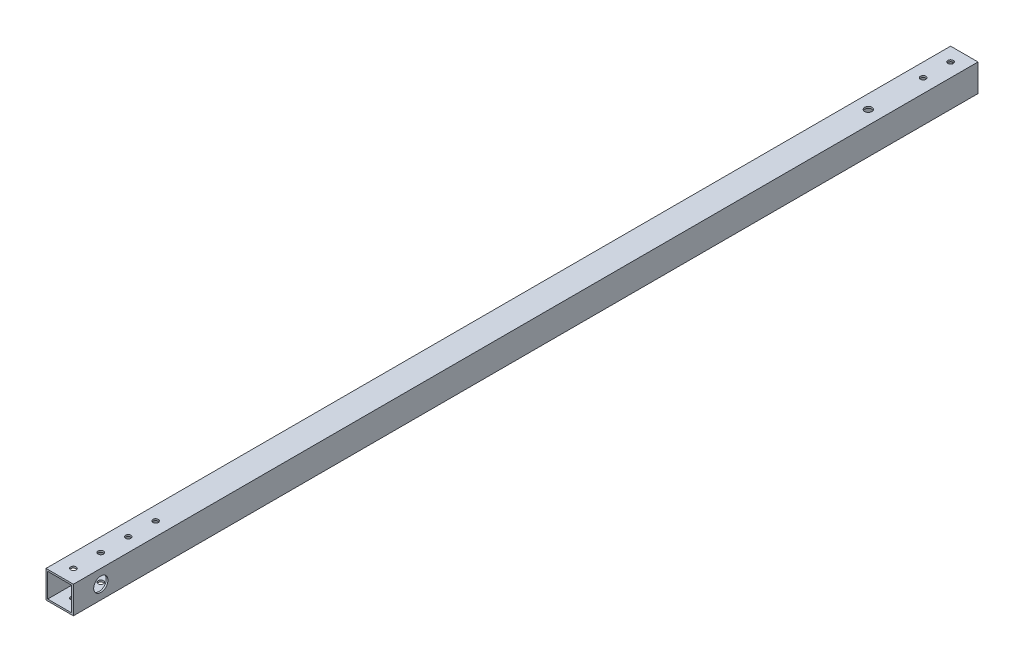
ISO-10303-21;
HEADER;
FILE_DESCRIPTION(('STEP AP214'),'2;1');
FILE_NAME('part.step','',(''),(''),'','','');
FILE_SCHEMA(('AUTOMOTIVE_DESIGN { 1 0 10303 214 1 1 1 1 }'));
ENDSEC;
DATA;
#1=APPLICATION_CONTEXT('core data for automotive mechanical design processes');
#2=APPLICATION_PROTOCOL_DEFINITION('international standard','automotive_design',2000,#1);
#3=PRODUCT_CONTEXT('',#1,'mechanical');
#4=PRODUCT('Part','Part','',(#3));
#5=PRODUCT_RELATED_PRODUCT_CATEGORY('part','',(#4));
#6=PRODUCT_DEFINITION_FORMATION('','',#4);
#7=PRODUCT_DEFINITION_CONTEXT('part definition',#1,'design');
#8=PRODUCT_DEFINITION('design','',#6,#7);
#9=PRODUCT_DEFINITION_SHAPE('','',#8);
#10=(LENGTH_UNIT() NAMED_UNIT(*) SI_UNIT(.MILLI.,.METRE.));
#11=(NAMED_UNIT(*) PLANE_ANGLE_UNIT() SI_UNIT($,.RADIAN.));
#12=(NAMED_UNIT(*) SI_UNIT($,.STERADIAN.) SOLID_ANGLE_UNIT());
#13=UNCERTAINTY_MEASURE_WITH_UNIT(LENGTH_MEASURE(1.E-05),#10,'distance_accuracy_value','');
#14=(GEOMETRIC_REPRESENTATION_CONTEXT(3) GLOBAL_UNCERTAINTY_ASSIGNED_CONTEXT((#13)) GLOBAL_UNIT_ASSIGNED_CONTEXT((#10,
#11,#12)) REPRESENTATION_CONTEXT('',''));
#15=CARTESIAN_POINT('',(0.,0.,0.));
#16=DIRECTION('',(0.,0.,1.));
#17=DIRECTION('',(1.,0.,0.));
#18=AXIS2_PLACEMENT_3D('',#15,#16,#17);
#19=CARTESIAN_POINT('',(0.,0.,838.2));
#20=DIRECTION('',(0.,0.,-1.));
#21=DIRECTION('',(-1.,0.,0.));
#22=AXIS2_PLACEMENT_3D('',#19,#20,#21);
#23=PLANE('',#22);
#24=DIRECTION('',(0.,-1.,0.));
#25=VECTOR('',#24,1.);
#26=CARTESIAN_POINT('',(0.,0.,838.2));
#27=LINE('',#26,#25);
#28=CARTESIAN_POINT('',(0.,25.4,838.2));
#29=VERTEX_POINT('',#28);
#30=CARTESIAN_POINT('',(0.,0.,838.2));
#31=VERTEX_POINT('',#30);
#32=EDGE_CURVE('E156',#29,#31,#27,.T.);
#33=ORIENTED_EDGE('',*,*,#32,.T.);
#34=DIRECTION('',(1.,0.,0.));
#35=VECTOR('',#34,1.);
#36=CARTESIAN_POINT('',(0.,0.,838.2));
#37=LINE('',#36,#35);
#38=CARTESIAN_POINT('',(25.4,0.,838.2));
#39=VERTEX_POINT('',#38);
#40=EDGE_CURVE('E160',#31,#39,#37,.T.);
#41=ORIENTED_EDGE('',*,*,#40,.T.);
#42=DIRECTION('',(0.,1.,0.));
#43=VECTOR('',#42,1.);
#44=CARTESIAN_POINT('',(25.4,0.,838.2));
#45=LINE('',#44,#43);
#46=CARTESIAN_POINT('',(25.4,25.4,838.2));
#47=VERTEX_POINT('',#46);
#48=EDGE_CURVE('E164',#39,#47,#45,.T.);
#49=ORIENTED_EDGE('',*,*,#48,.T.);
#50=DIRECTION('',(-1.,0.,0.));
#51=VECTOR('',#50,1.);
#52=CARTESIAN_POINT('',(0.,25.4,838.2));
#53=LINE('',#52,#51);
#54=EDGE_CURVE('E167',#47,#29,#53,.T.);
#55=ORIENTED_EDGE('',*,*,#54,.T.);
#56=EDGE_LOOP('',(#33,#41,#49,#55));
#57=FACE_BOUND('',#56,.T.);
#58=DIRECTION('',(0.,-1.,0.));
#59=VECTOR('',#58,1.);
#60=CARTESIAN_POINT('',(1.5875,1.5875,838.2));
#61=LINE('',#60,#59);
#62=CARTESIAN_POINT('',(1.5875,23.8125,838.2));
#63=VERTEX_POINT('',#62);
#64=CARTESIAN_POINT('',(1.5875,1.5875,838.2));
#65=VERTEX_POINT('',#64);
#66=EDGE_CURVE('E106',#63,#65,#61,.T.);
#67=ORIENTED_EDGE('',*,*,#66,.F.);
#68=DIRECTION('',(-1.,0.,0.));
#69=VECTOR('',#68,1.);
#70=CARTESIAN_POINT('',(1.5875,23.8125,838.2));
#71=LINE('',#70,#69);
#72=CARTESIAN_POINT('',(23.8125,23.8125,838.2));
#73=VERTEX_POINT('',#72);
#74=EDGE_CURVE('E132',#73,#63,#71,.T.);
#75=ORIENTED_EDGE('',*,*,#74,.F.);
#76=DIRECTION('',(0.,1.,0.));
#77=VECTOR('',#76,1.);
#78=CARTESIAN_POINT('',(23.8125,1.5875,838.2));
#79=LINE('',#78,#77);
#80=CARTESIAN_POINT('',(23.8125,1.5875,838.2));
#81=VERTEX_POINT('',#80);
#82=EDGE_CURVE('E128',#81,#73,#79,.T.);
#83=ORIENTED_EDGE('',*,*,#82,.F.);
#84=DIRECTION('',(1.,0.,0.));
#85=VECTOR('',#84,1.);
#86=CARTESIAN_POINT('',(1.5875,1.5875,838.2));
#87=LINE('',#86,#85);
#88=EDGE_CURVE('E115',#65,#81,#87,.T.);
#89=ORIENTED_EDGE('',*,*,#88,.F.);
#90=EDGE_LOOP('',(#67,#75,#83,#89));
#91=FACE_BOUND('',#90,.T.);
#92=ADVANCED_FACE('F38',(#57,#91),#23,.F.);
#93=CARTESIAN_POINT('',(0.,0.,0.));
#94=DIRECTION('',(0.,0.,-1.));
#95=DIRECTION('',(-1.,0.,0.));
#96=AXIS2_PLACEMENT_3D('',#93,#94,#95);
#97=PLANE('',#96);
#98=DIRECTION('',(0.,-1.,0.));
#99=VECTOR('',#98,1.);
#100=CARTESIAN_POINT('',(0.,0.,0.));
#101=LINE('',#100,#99);
#102=CARTESIAN_POINT('',(0.,25.4,0.));
#103=VERTEX_POINT('',#102);
#104=CARTESIAN_POINT('',(0.,0.,0.));
#105=VERTEX_POINT('',#104);
#106=EDGE_CURVE('E124',#103,#105,#101,.T.);
#107=ORIENTED_EDGE('',*,*,#106,.F.);
#108=DIRECTION('',(-1.,0.,0.));
#109=VECTOR('',#108,1.);
#110=CARTESIAN_POINT('',(0.,25.4,0.));
#111=LINE('',#110,#109);
#112=CARTESIAN_POINT('',(25.4,25.4,0.));
#113=VERTEX_POINT('',#112);
#114=EDGE_CURVE('E161',#113,#103,#111,.T.);
#115=ORIENTED_EDGE('',*,*,#114,.F.);
#116=DIRECTION('',(0.,1.,0.));
#117=VECTOR('',#116,1.);
#118=CARTESIAN_POINT('',(25.4,0.,0.));
#119=LINE('',#118,#117);
#120=CARTESIAN_POINT('',(25.4,0.,0.));
#121=VERTEX_POINT('',#120);
#122=EDGE_CURVE('E177',#121,#113,#119,.T.);
#123=ORIENTED_EDGE('',*,*,#122,.F.);
#124=DIRECTION('',(1.,0.,0.));
#125=VECTOR('',#124,1.);
#126=CARTESIAN_POINT('',(0.,0.,0.));
#127=LINE('',#126,#125);
#128=EDGE_CURVE('E174',#105,#121,#127,.T.);
#129=ORIENTED_EDGE('',*,*,#128,.F.);
#130=EDGE_LOOP('',(#107,#115,#123,#129));
#131=FACE_BOUND('',#130,.T.);
#132=DIRECTION('',(-1.,0.,0.));
#133=VECTOR('',#132,1.);
#134=CARTESIAN_POINT('',(1.5875,23.8125,0.));
#135=LINE('',#134,#133);
#136=CARTESIAN_POINT('',(23.8125,23.8125,0.));
#137=VERTEX_POINT('',#136);
#138=CARTESIAN_POINT('',(1.5875,23.8125,0.));
#139=VERTEX_POINT('',#138);
#140=EDGE_CURVE('E116',#137,#139,#135,.T.);
#141=ORIENTED_EDGE('',*,*,#140,.T.);
#142=DIRECTION('',(0.,-1.,0.));
#143=VECTOR('',#142,1.);
#144=CARTESIAN_POINT('',(1.5875,1.5875,0.));
#145=LINE('',#144,#143);
#146=CARTESIAN_POINT('',(1.5875,1.5875,0.));
#147=VERTEX_POINT('',#146);
#148=EDGE_CURVE('E64',#139,#147,#145,.T.);
#149=ORIENTED_EDGE('',*,*,#148,.T.);
#150=DIRECTION('',(1.,0.,0.));
#151=VECTOR('',#150,1.);
#152=CARTESIAN_POINT('',(1.5875,1.5875,0.));
#153=LINE('',#152,#151);
#154=CARTESIAN_POINT('',(23.8125,1.5875,0.));
#155=VERTEX_POINT('',#154);
#156=EDGE_CURVE('E122',#147,#155,#153,.T.);
#157=ORIENTED_EDGE('',*,*,#156,.T.);
#158=DIRECTION('',(0.,1.,0.));
#159=VECTOR('',#158,1.);
#160=CARTESIAN_POINT('',(23.8125,1.5875,0.));
#161=LINE('',#160,#159);
#162=EDGE_CURVE('E143',#155,#137,#161,.T.);
#163=ORIENTED_EDGE('',*,*,#162,.T.);
#164=EDGE_LOOP('',(#141,#149,#157,#163));
#165=FACE_BOUND('',#164,.T.);
#166=ADVANCED_FACE('F332',(#131,#165),#97,.T.);
#167=CARTESIAN_POINT('',(0.,0.,838.2));
#168=DIRECTION('',(1.,0.,0.));
#169=DIRECTION('',(0.,0.,-1.));
#170=AXIS2_PLACEMENT_3D('',#167,#168,#169);
#171=PLANE('',#170);
#172=CARTESIAN_POINT('',(0.,12.7,812.8));
#173=DIRECTION('',(1.,0.,0.));
#174=DIRECTION('',(0.,0.,-1.));
#175=AXIS2_PLACEMENT_3D('',#172,#173,#174);
#176=CIRCLE('',#175,6.60400000000008);
#177=CARTESIAN_POINT('',(0.,12.7,806.196));
#178=VERTEX_POINT('',#177);
#179=EDGE_CURVE('E313',#178,#178,#176,.T.);
#180=ORIENTED_EDGE('',*,*,#179,.T.);
#181=EDGE_LOOP('',(#180));
#182=FACE_BOUND('',#181,.T.);
#183=ORIENTED_EDGE('',*,*,#106,.T.);
#184=DIRECTION('',(0.,0.,-1.));
#185=VECTOR('',#184,1.);
#186=CARTESIAN_POINT('',(0.,0.,838.2));
#187=LINE('',#186,#185);
#188=EDGE_CURVE('E11',#31,#105,#187,.T.);
#189=ORIENTED_EDGE('',*,*,#188,.F.);
#190=ORIENTED_EDGE('',*,*,#32,.F.);
#191=DIRECTION('',(0.,0.,-1.));
#192=VECTOR('',#191,1.);
#193=CARTESIAN_POINT('',(0.,25.4,838.2));
#194=LINE('',#193,#192);
#195=EDGE_CURVE('E170',#29,#103,#194,.T.);
#196=ORIENTED_EDGE('',*,*,#195,.T.);
#197=EDGE_LOOP('',(#183,#189,#190,#196));
#198=FACE_BOUND('',#197,.T.);
#199=ADVANCED_FACE('F40',(#182,#198),#171,.F.);
#200=CARTESIAN_POINT('',(0.,0.,838.2));
#201=DIRECTION('',(0.,1.,0.));
#202=DIRECTION('',(0.,0.,1.));
#203=AXIS2_PLACEMENT_3D('',#200,#201,#202);
#204=PLANE('',#203);
#205=CARTESIAN_POINT('',(12.7,0.,12.7));
#206=DIRECTION('',(0.,1.,0.));
#207=DIRECTION('',(0.,0.,1.));
#208=AXIS2_PLACEMENT_3D('',#205,#206,#207);
#209=CIRCLE('',#208,2.54);
#210=CARTESIAN_POINT('',(12.7,0.,15.24));
#211=VERTEX_POINT('',#210);
#212=EDGE_CURVE('E197',#211,#211,#209,.T.);
#213=ORIENTED_EDGE('',*,*,#212,.T.);
#214=EDGE_LOOP('',(#213));
#215=FACE_BOUND('',#214,.T.);
#216=CARTESIAN_POINT('',(12.7,0.,749.3));
#217=DIRECTION('',(0.,1.,0.));
#218=DIRECTION('',(0.,0.,1.));
#219=AXIS2_PLACEMENT_3D('',#216,#217,#218);
#220=CIRCLE('',#219,2.53999999999992);
#221=CARTESIAN_POINT('',(12.7,0.,751.84));
#222=VERTEX_POINT('',#221);
#223=EDGE_CURVE('E288',#222,#222,#220,.T.);
#224=ORIENTED_EDGE('',*,*,#223,.T.);
#225=EDGE_LOOP('',(#224));
#226=FACE_BOUND('',#225,.T.);
#227=CARTESIAN_POINT('',(12.7,0.,774.7));
#228=DIRECTION('',(0.,1.,0.));
#229=DIRECTION('',(0.,0.,1.));
#230=AXIS2_PLACEMENT_3D('',#227,#228,#229);
#231=CIRCLE('',#230,2.53999999999992);
#232=CARTESIAN_POINT('',(12.7,0.,777.24));
#233=VERTEX_POINT('',#232);
#234=EDGE_CURVE('E273',#233,#233,#231,.T.);
#235=ORIENTED_EDGE('',*,*,#234,.T.);
#236=EDGE_LOOP('',(#235));
#237=FACE_BOUND('',#236,.T.);
#238=CARTESIAN_POINT('',(12.7,0.,88.9));
#239=DIRECTION('',(0.,1.,0.));
#240=DIRECTION('',(0.,0.,1.));
#241=AXIS2_PLACEMENT_3D('',#238,#239,#240);
#242=CIRCLE('',#241,3.42900000000001);
#243=CARTESIAN_POINT('',(12.7,0.,92.329));
#244=VERTEX_POINT('',#243);
#245=EDGE_CURVE('E263',#244,#244,#242,.T.);
#246=ORIENTED_EDGE('',*,*,#245,.T.);
#247=EDGE_LOOP('',(#246));
#248=FACE_BOUND('',#247,.T.);
#249=CARTESIAN_POINT('',(12.7,0.,825.5));
#250=DIRECTION('',(0.,1.,0.));
#251=DIRECTION('',(0.,0.,1.));
#252=AXIS2_PLACEMENT_3D('',#249,#250,#251);
#253=CIRCLE('',#252,2.53999999999992);
#254=CARTESIAN_POINT('',(12.7,0.,828.04));
#255=VERTEX_POINT('',#254);
#256=EDGE_CURVE('E254',#255,#255,#253,.T.);
#257=ORIENTED_EDGE('',*,*,#256,.T.);
#258=EDGE_LOOP('',(#257));
#259=FACE_BOUND('',#258,.T.);
#260=CARTESIAN_POINT('',(12.7,0.,38.1));
#261=DIRECTION('',(0.,1.,0.));
#262=DIRECTION('',(0.,0.,1.));
#263=AXIS2_PLACEMENT_3D('',#260,#261,#262);
#264=CIRCLE('',#263,2.54);
#265=CARTESIAN_POINT('',(12.7,0.,40.64));
#266=VERTEX_POINT('',#265);
#267=EDGE_CURVE('E255',#266,#266,#264,.T.);
#268=ORIENTED_EDGE('',*,*,#267,.T.);
#269=EDGE_LOOP('',(#268));
#270=FACE_BOUND('',#269,.T.);
#271=CARTESIAN_POINT('',(12.7,0.,800.1));
#272=DIRECTION('',(0.,1.,0.));
#273=DIRECTION('',(0.,0.,1.));
#274=AXIS2_PLACEMENT_3D('',#271,#272,#273);
#275=CIRCLE('',#274,2.53999999999992);
#276=CARTESIAN_POINT('',(12.7,0.,802.64));
#277=VERTEX_POINT('',#276);
#278=EDGE_CURVE('E272',#277,#277,#275,.T.);
#279=ORIENTED_EDGE('',*,*,#278,.T.);
#280=EDGE_LOOP('',(#279));
#281=FACE_BOUND('',#280,.T.);
#282=ORIENTED_EDGE('',*,*,#128,.T.);
#283=DIRECTION('',(0.,0.,-1.));
#284=VECTOR('',#283,1.);
#285=CARTESIAN_POINT('',(25.4,0.,838.2));
#286=LINE('',#285,#284);
#287=EDGE_CURVE('E48',#39,#121,#286,.T.);
#288=ORIENTED_EDGE('',*,*,#287,.F.);
#289=ORIENTED_EDGE('',*,*,#40,.F.);
#290=ORIENTED_EDGE('',*,*,#188,.T.);
#291=EDGE_LOOP('',(#282,#288,#289,#290));
#292=FACE_BOUND('',#291,.T.);
#293=ADVANCED_FACE('F364',(#215,#226,#237,#248,#259,#270,#281,#292),#204,.F.);
#294=CARTESIAN_POINT('',(25.4,0.,838.2));
#295=DIRECTION('',(-1.,0.,0.));
#296=DIRECTION('',(0.,0.,1.));
#297=AXIS2_PLACEMENT_3D('',#294,#295,#296);
#298=PLANE('',#297);
#299=CARTESIAN_POINT('',(25.4,12.7,812.8));
#300=DIRECTION('',(-1.,0.,0.));
#301=DIRECTION('',(0.,0.,1.));
#302=AXIS2_PLACEMENT_3D('',#299,#300,#301);
#303=CIRCLE('',#302,6.60400000000008);
#304=CARTESIAN_POINT('',(25.4,12.7,819.404));
#305=VERTEX_POINT('',#304);
#306=EDGE_CURVE('E289',#305,#305,#303,.T.);
#307=ORIENTED_EDGE('',*,*,#306,.T.);
#308=EDGE_LOOP('',(#307));
#309=FACE_BOUND('',#308,.T.);
#310=ORIENTED_EDGE('',*,*,#122,.T.);
#311=DIRECTION('',(0.,0.,-1.));
#312=VECTOR('',#311,1.);
#313=CARTESIAN_POINT('',(25.4,25.4,838.2));
#314=LINE('',#313,#312);
#315=EDGE_CURVE('E185',#47,#113,#314,.T.);
#316=ORIENTED_EDGE('',*,*,#315,.F.);
#317=ORIENTED_EDGE('',*,*,#48,.F.);
#318=ORIENTED_EDGE('',*,*,#287,.T.);
#319=EDGE_LOOP('',(#310,#316,#317,#318));
#320=FACE_BOUND('',#319,.T.);
#321=ADVANCED_FACE('F361',(#309,#320),#298,.F.);
#322=CARTESIAN_POINT('',(0.,25.4,838.2));
#323=DIRECTION('',(0.,-1.,0.));
#324=DIRECTION('',(0.,0.,-1.));
#325=AXIS2_PLACEMENT_3D('',#322,#323,#324);
#326=PLANE('',#325);
#327=CARTESIAN_POINT('',(12.7,25.4,12.7));
#328=DIRECTION('',(0.,1.,0.));
#329=DIRECTION('',(0.,0.,1.));
#330=AXIS2_PLACEMENT_3D('',#327,#328,#329);
#331=CIRCLE('',#330,2.54);
#332=CARTESIAN_POINT('',(12.7,25.4,15.24));
#333=VERTEX_POINT('',#332);
#334=EDGE_CURVE('E267',#333,#333,#331,.T.);
#335=ORIENTED_EDGE('',*,*,#334,.F.);
#336=EDGE_LOOP('',(#335));
#337=FACE_BOUND('',#336,.T.);
#338=CARTESIAN_POINT('',(12.7,25.4,749.3));
#339=DIRECTION('',(0.,1.,0.));
#340=DIRECTION('',(0.,0.,1.));
#341=AXIS2_PLACEMENT_3D('',#338,#339,#340);
#342=CIRCLE('',#341,2.53999999999992);
#343=CARTESIAN_POINT('',(12.7,25.4,751.84));
#344=VERTEX_POINT('',#343);
#345=EDGE_CURVE('E284',#344,#344,#342,.T.);
#346=ORIENTED_EDGE('',*,*,#345,.F.);
#347=EDGE_LOOP('',(#346));
#348=FACE_BOUND('',#347,.T.);
#349=CARTESIAN_POINT('',(12.7,25.4,774.7));
#350=DIRECTION('',(0.,1.,0.));
#351=DIRECTION('',(0.,0.,1.));
#352=AXIS2_PLACEMENT_3D('',#349,#350,#351);
#353=CIRCLE('',#352,2.53999999999992);
#354=CARTESIAN_POINT('',(12.7,25.4,777.24));
#355=VERTEX_POINT('',#354);
#356=EDGE_CURVE('E293',#355,#355,#353,.T.);
#357=ORIENTED_EDGE('',*,*,#356,.F.);
#358=EDGE_LOOP('',(#357));
#359=FACE_BOUND('',#358,.T.);
#360=CARTESIAN_POINT('',(12.7,25.4,88.9));
#361=DIRECTION('',(0.,1.,0.));
#362=DIRECTION('',(0.,0.,1.));
#363=AXIS2_PLACEMENT_3D('',#360,#361,#362);
#364=CIRCLE('',#363,3.42900000000001);
#365=CARTESIAN_POINT('',(12.7,25.4,92.329));
#366=VERTEX_POINT('',#365);
#367=EDGE_CURVE('E259',#366,#366,#364,.T.);
#368=ORIENTED_EDGE('',*,*,#367,.F.);
#369=EDGE_LOOP('',(#368));
#370=FACE_BOUND('',#369,.T.);
#371=CARTESIAN_POINT('',(12.7,25.4,825.5));
#372=DIRECTION('',(0.,1.,0.));
#373=DIRECTION('',(0.,0.,1.));
#374=AXIS2_PLACEMENT_3D('',#371,#372,#373);
#375=CIRCLE('',#374,2.53999999999992);
#376=CARTESIAN_POINT('',(12.7,25.4,828.04));
#377=VERTEX_POINT('',#376);
#378=EDGE_CURVE('E250',#377,#377,#375,.T.);
#379=ORIENTED_EDGE('',*,*,#378,.F.);
#380=EDGE_LOOP('',(#379));
#381=FACE_BOUND('',#380,.T.);
#382=CARTESIAN_POINT('',(12.7,25.4,38.1));
#383=DIRECTION('',(0.,1.,0.));
#384=DIRECTION('',(0.,0.,1.));
#385=AXIS2_PLACEMENT_3D('',#382,#383,#384);
#386=CIRCLE('',#385,2.54);
#387=CARTESIAN_POINT('',(12.7,25.4,40.64));
#388=VERTEX_POINT('',#387);
#389=EDGE_CURVE('E277',#388,#388,#386,.T.);
#390=ORIENTED_EDGE('',*,*,#389,.F.);
#391=EDGE_LOOP('',(#390));
#392=FACE_BOUND('',#391,.T.);
#393=CARTESIAN_POINT('',(12.7,25.4,800.1));
#394=DIRECTION('',(0.,1.,0.));
#395=DIRECTION('',(0.,0.,1.));
#396=AXIS2_PLACEMENT_3D('',#393,#394,#395);
#397=CIRCLE('',#396,2.53999999999992);
#398=CARTESIAN_POINT('',(12.7,25.4,802.64));
#399=VERTEX_POINT('',#398);
#400=EDGE_CURVE('E268',#399,#399,#397,.T.);
#401=ORIENTED_EDGE('',*,*,#400,.F.);
#402=EDGE_LOOP('',(#401));
#403=FACE_BOUND('',#402,.T.);
#404=ORIENTED_EDGE('',*,*,#114,.T.);
#405=ORIENTED_EDGE('',*,*,#195,.F.);
#406=ORIENTED_EDGE('',*,*,#54,.F.);
#407=ORIENTED_EDGE('',*,*,#315,.T.);
#408=EDGE_LOOP('',(#404,#405,#406,#407));
#409=FACE_BOUND('',#408,.T.);
#410=ADVANCED_FACE('F358',(#337,#348,#359,#370,#381,#392,#403,#409),#326,.F.);
#411=CARTESIAN_POINT('',(1.5875,1.5875,838.2));
#412=DIRECTION('',(1.,0.,0.));
#413=DIRECTION('',(0.,0.,-1.));
#414=AXIS2_PLACEMENT_3D('',#411,#412,#413);
#415=PLANE('',#414);
#416=CARTESIAN_POINT('',(1.5875,12.7,812.8));
#417=DIRECTION('',(1.,0.,0.));
#418=DIRECTION('',(0.,0.,-1.));
#419=AXIS2_PLACEMENT_3D('',#416,#417,#418);
#420=CIRCLE('',#419,6.60400000000008);
#421=CARTESIAN_POINT('',(1.5875,12.7,806.196));
#422=VERTEX_POINT('',#421);
#423=EDGE_CURVE('E309',#422,#422,#420,.T.);
#424=ORIENTED_EDGE('',*,*,#423,.F.);
#425=EDGE_LOOP('',(#424));
#426=FACE_BOUND('',#425,.T.);
#427=ORIENTED_EDGE('',*,*,#148,.F.);
#428=DIRECTION('',(0.,0.,-1.));
#429=VECTOR('',#428,1.);
#430=CARTESIAN_POINT('',(1.5875,23.8125,838.2));
#431=LINE('',#430,#429);
#432=EDGE_CURVE('E110',#63,#139,#431,.T.);
#433=ORIENTED_EDGE('',*,*,#432,.F.);
#434=ORIENTED_EDGE('',*,*,#66,.T.);
#435=DIRECTION('',(0.,0.,-1.));
#436=VECTOR('',#435,1.);
#437=CARTESIAN_POINT('',(1.5875,1.5875,838.2));
#438=LINE('',#437,#436);
#439=EDGE_CURVE('E109',#65,#147,#438,.T.);
#440=ORIENTED_EDGE('',*,*,#439,.T.);
#441=EDGE_LOOP('',(#427,#433,#434,#440));
#442=FACE_BOUND('',#441,.T.);
#443=ADVANCED_FACE('F108',(#426,#442),#415,.T.);
#444=CARTESIAN_POINT('',(1.5875,1.5875,838.2));
#445=DIRECTION('',(0.,1.,0.));
#446=DIRECTION('',(0.,0.,1.));
#447=AXIS2_PLACEMENT_3D('',#444,#445,#446);
#448=PLANE('',#447);
#449=CARTESIAN_POINT('',(12.7,1.5875,12.7));
#450=DIRECTION('',(0.,1.,0.));
#451=DIRECTION('',(0.,0.,1.));
#452=AXIS2_PLACEMENT_3D('',#449,#450,#451);
#453=CIRCLE('',#452,2.54);
#454=CARTESIAN_POINT('',(12.7,1.5875,15.24));
#455=VERTEX_POINT('',#454);
#456=EDGE_CURVE('E140',#455,#455,#453,.T.);
#457=ORIENTED_EDGE('',*,*,#456,.F.);
#458=EDGE_LOOP('',(#457));
#459=FACE_BOUND('',#458,.T.);
#460=CARTESIAN_POINT('',(12.7,1.5875,749.3));
#461=DIRECTION('',(0.,1.,0.));
#462=DIRECTION('',(0.,0.,1.));
#463=AXIS2_PLACEMENT_3D('',#460,#461,#462);
#464=CIRCLE('',#463,2.53999999999992);
#465=CARTESIAN_POINT('',(12.7,1.5875,751.84));
#466=VERTEX_POINT('',#465);
#467=EDGE_CURVE('E221',#466,#466,#464,.T.);
#468=ORIENTED_EDGE('',*,*,#467,.F.);
#469=EDGE_LOOP('',(#468));
#470=FACE_BOUND('',#469,.T.);
#471=CARTESIAN_POINT('',(12.7,1.5875,774.7));
#472=DIRECTION('',(0.,1.,0.));
#473=DIRECTION('',(0.,0.,1.));
#474=AXIS2_PLACEMENT_3D('',#471,#472,#473);
#475=CIRCLE('',#474,2.53999999999992);
#476=CARTESIAN_POINT('',(12.7,1.5875,777.24));
#477=VERTEX_POINT('',#476);
#478=EDGE_CURVE('E217',#477,#477,#475,.T.);
#479=ORIENTED_EDGE('',*,*,#478,.F.);
#480=EDGE_LOOP('',(#479));
#481=FACE_BOUND('',#480,.T.);
#482=CARTESIAN_POINT('',(12.7,1.5875,88.9));
#483=DIRECTION('',(0.,1.,0.));
#484=DIRECTION('',(0.,0.,1.));
#485=AXIS2_PLACEMENT_3D('',#482,#483,#484);
#486=CIRCLE('',#485,3.42900000000001);
#487=CARTESIAN_POINT('',(12.7,1.5875,92.329));
#488=VERTEX_POINT('',#487);
#489=EDGE_CURVE('E212',#488,#488,#486,.T.);
#490=ORIENTED_EDGE('',*,*,#489,.F.);
#491=EDGE_LOOP('',(#490));
#492=FACE_BOUND('',#491,.T.);
#493=CARTESIAN_POINT('',(12.7,1.5875,825.5));
#494=DIRECTION('',(0.,1.,0.));
#495=DIRECTION('',(0.,0.,1.));
#496=AXIS2_PLACEMENT_3D('',#493,#494,#495);
#497=CIRCLE('',#496,2.53999999999992);
#498=CARTESIAN_POINT('',(12.7,1.5875,828.04));
#499=VERTEX_POINT('',#498);
#500=EDGE_CURVE('E207',#499,#499,#497,.T.);
#501=ORIENTED_EDGE('',*,*,#500,.F.);
#502=EDGE_LOOP('',(#501));
#503=FACE_BOUND('',#502,.T.);
#504=CARTESIAN_POINT('',(12.7,1.5875,38.1));
#505=DIRECTION('',(0.,1.,0.));
#506=DIRECTION('',(0.,0.,1.));
#507=AXIS2_PLACEMENT_3D('',#504,#505,#506);
#508=CIRCLE('',#507,2.54);
#509=CARTESIAN_POINT('',(12.7,1.5875,40.64));
#510=VERTEX_POINT('',#509);
#511=EDGE_CURVE('E202',#510,#510,#508,.T.);
#512=ORIENTED_EDGE('',*,*,#511,.F.);
#513=EDGE_LOOP('',(#512));
#514=FACE_BOUND('',#513,.T.);
#515=CARTESIAN_POINT('',(12.7,1.5875,800.1));
#516=DIRECTION('',(0.,1.,0.));
#517=DIRECTION('',(0.,0.,1.));
#518=AXIS2_PLACEMENT_3D('',#515,#516,#517);
#519=CIRCLE('',#518,2.53999999999992);
#520=CARTESIAN_POINT('',(12.7,1.5875,802.64));
#521=VERTEX_POINT('',#520);
#522=EDGE_CURVE('E196',#521,#521,#519,.T.);
#523=ORIENTED_EDGE('',*,*,#522,.F.);
#524=EDGE_LOOP('',(#523));
#525=FACE_BOUND('',#524,.T.);
#526=ORIENTED_EDGE('',*,*,#156,.F.);
#527=ORIENTED_EDGE('',*,*,#439,.F.);
#528=ORIENTED_EDGE('',*,*,#88,.T.);
#529=DIRECTION('',(0.,0.,-1.));
#530=VECTOR('',#529,1.);
#531=CARTESIAN_POINT('',(23.8125,1.5875,838.2));
#532=LINE('',#531,#530);
#533=EDGE_CURVE('E125',#81,#155,#532,.T.);
#534=ORIENTED_EDGE('',*,*,#533,.T.);
#535=EDGE_LOOP('',(#526,#527,#528,#534));
#536=FACE_BOUND('',#535,.T.);
#537=ADVANCED_FACE('F119',(#459,#470,#481,#492,#503,#514,#525,#536),#448,.T.);
#538=CARTESIAN_POINT('',(23.8125,1.5875,838.2));
#539=DIRECTION('',(-1.,0.,0.));
#540=DIRECTION('',(0.,0.,1.));
#541=AXIS2_PLACEMENT_3D('',#538,#539,#540);
#542=PLANE('',#541);
#543=CARTESIAN_POINT('',(23.8125,12.7,812.8));
#544=DIRECTION('',(-1.,0.,0.));
#545=DIRECTION('',(0.,0.,1.));
#546=AXIS2_PLACEMENT_3D('',#543,#544,#545);
#547=CIRCLE('',#546,6.60400000000008);
#548=CARTESIAN_POINT('',(23.8125,12.7,819.404));
#549=VERTEX_POINT('',#548);
#550=EDGE_CURVE('E42',#549,#549,#547,.T.);
#551=ORIENTED_EDGE('',*,*,#550,.F.);
#552=EDGE_LOOP('',(#551));
#553=FACE_BOUND('',#552,.T.);
#554=ORIENTED_EDGE('',*,*,#162,.F.);
#555=ORIENTED_EDGE('',*,*,#533,.F.);
#556=ORIENTED_EDGE('',*,*,#82,.T.);
#557=DIRECTION('',(0.,0.,-1.));
#558=VECTOR('',#557,1.);
#559=CARTESIAN_POINT('',(23.8125,23.8125,838.2));
#560=LINE('',#559,#558);
#561=EDGE_CURVE('E56',#73,#137,#560,.T.);
#562=ORIENTED_EDGE('',*,*,#561,.T.);
#563=EDGE_LOOP('',(#554,#555,#556,#562));
#564=FACE_BOUND('',#563,.T.);
#565=ADVANCED_FACE('F325',(#553,#564),#542,.T.);
#566=CARTESIAN_POINT('',(1.5875,23.8125,838.2));
#567=DIRECTION('',(0.,-1.,0.));
#568=DIRECTION('',(0.,0.,-1.));
#569=AXIS2_PLACEMENT_3D('',#566,#567,#568);
#570=PLANE('',#569);
#571=CARTESIAN_POINT('',(12.7,23.8125,12.7));
#572=DIRECTION('',(0.,-1.,0.));
#573=DIRECTION('',(0.,0.,-1.));
#574=AXIS2_PLACEMENT_3D('',#571,#572,#573);
#575=CIRCLE('',#574,2.54);
#576=CARTESIAN_POINT('',(12.7,23.8125,10.16));
#577=VERTEX_POINT('',#576);
#578=EDGE_CURVE('E222',#577,#577,#575,.T.);
#579=ORIENTED_EDGE('',*,*,#578,.F.);
#580=EDGE_LOOP('',(#579));
#581=FACE_BOUND('',#580,.T.);
#582=CARTESIAN_POINT('',(12.7,23.8125,749.3));
#583=DIRECTION('',(0.,-1.,0.));
#584=DIRECTION('',(0.,0.,-1.));
#585=AXIS2_PLACEMENT_3D('',#582,#583,#584);
#586=CIRCLE('',#585,2.53999999999992);
#587=CARTESIAN_POINT('',(12.7,23.8125,746.76));
#588=VERTEX_POINT('',#587);
#589=EDGE_CURVE('E218',#588,#588,#586,.T.);
#590=ORIENTED_EDGE('',*,*,#589,.F.);
#591=EDGE_LOOP('',(#590));
#592=FACE_BOUND('',#591,.T.);
#593=CARTESIAN_POINT('',(12.7,23.8125,774.7));
#594=DIRECTION('',(0.,-1.,0.));
#595=DIRECTION('',(0.,0.,-1.));
#596=AXIS2_PLACEMENT_3D('',#593,#594,#595);
#597=CIRCLE('',#596,2.53999999999992);
#598=CARTESIAN_POINT('',(12.7,23.8125,772.16));
#599=VERTEX_POINT('',#598);
#600=EDGE_CURVE('E213',#599,#599,#597,.T.);
#601=ORIENTED_EDGE('',*,*,#600,.F.);
#602=EDGE_LOOP('',(#601));
#603=FACE_BOUND('',#602,.T.);
#604=CARTESIAN_POINT('',(12.7,23.8125,88.9));
#605=DIRECTION('',(0.,-1.,0.));
#606=DIRECTION('',(0.,0.,-1.));
#607=AXIS2_PLACEMENT_3D('',#604,#605,#606);
#608=CIRCLE('',#607,3.42900000000001);
#609=CARTESIAN_POINT('',(12.7,23.8125,85.471));
#610=VERTEX_POINT('',#609);
#611=EDGE_CURVE('E208',#610,#610,#608,.T.);
#612=ORIENTED_EDGE('',*,*,#611,.F.);
#613=EDGE_LOOP('',(#612));
#614=FACE_BOUND('',#613,.T.);
#615=CARTESIAN_POINT('',(12.7,23.8125,825.5));
#616=DIRECTION('',(0.,-1.,0.));
#617=DIRECTION('',(0.,0.,-1.));
#618=AXIS2_PLACEMENT_3D('',#615,#616,#617);
#619=CIRCLE('',#618,2.53999999999992);
#620=CARTESIAN_POINT('',(12.7,23.8125,822.96));
#621=VERTEX_POINT('',#620);
#622=EDGE_CURVE('E203',#621,#621,#619,.T.);
#623=ORIENTED_EDGE('',*,*,#622,.F.);
#624=EDGE_LOOP('',(#623));
#625=FACE_BOUND('',#624,.T.);
#626=CARTESIAN_POINT('',(12.7,23.8125,38.1));
#627=DIRECTION('',(0.,-1.,0.));
#628=DIRECTION('',(0.,0.,-1.));
#629=AXIS2_PLACEMENT_3D('',#626,#627,#628);
#630=CIRCLE('',#629,2.54);
#631=CARTESIAN_POINT('',(12.7,23.8125,35.56));
#632=VERTEX_POINT('',#631);
#633=EDGE_CURVE('E198',#632,#632,#630,.T.);
#634=ORIENTED_EDGE('',*,*,#633,.F.);
#635=EDGE_LOOP('',(#634));
#636=FACE_BOUND('',#635,.T.);
#637=CARTESIAN_POINT('',(12.7,23.8125,800.1));
#638=DIRECTION('',(0.,-1.,0.));
#639=DIRECTION('',(0.,0.,-1.));
#640=AXIS2_PLACEMENT_3D('',#637,#638,#639);
#641=CIRCLE('',#640,2.53999999999992);
#642=CARTESIAN_POINT('',(12.7,23.8125,797.56));
#643=VERTEX_POINT('',#642);
#644=EDGE_CURVE('E192',#643,#643,#641,.T.);
#645=ORIENTED_EDGE('',*,*,#644,.F.);
#646=EDGE_LOOP('',(#645));
#647=FACE_BOUND('',#646,.T.);
#648=ORIENTED_EDGE('',*,*,#140,.F.);
#649=ORIENTED_EDGE('',*,*,#561,.F.);
#650=ORIENTED_EDGE('',*,*,#74,.T.);
#651=ORIENTED_EDGE('',*,*,#432,.T.);
#652=EDGE_LOOP('',(#648,#649,#650,#651));
#653=FACE_BOUND('',#652,.T.);
#654=ADVANCED_FACE('F328',(#581,#592,#603,#614,#625,#636,#647,#653),#570,.T.);
#655=CARTESIAN_POINT('',(12.7,0.,800.1));
#656=DIRECTION('',(0.,1.,0.));
#657=DIRECTION('',(0.,0.,1.));
#658=AXIS2_PLACEMENT_3D('',#655,#656,#657);
#659=CYLINDRICAL_SURFACE('',#658,2.53999999999992);
#660=ORIENTED_EDGE('',*,*,#644,.T.);
#661=EDGE_LOOP('',(#660));
#662=FACE_BOUND('',#661,.T.);
#663=ORIENTED_EDGE('',*,*,#400,.T.);
#664=EDGE_LOOP('',(#663));
#665=FACE_BOUND('',#664,.T.);
#666=ADVANCED_FACE('F334',(#662,#665),#659,.F.);
#667=CARTESIAN_POINT('',(12.7,0.,38.1));
#668=DIRECTION('',(0.,1.,0.));
#669=DIRECTION('',(0.,0.,1.));
#670=AXIS2_PLACEMENT_3D('',#667,#668,#669);
#671=CYLINDRICAL_SURFACE('',#670,2.54);
#672=ORIENTED_EDGE('',*,*,#633,.T.);
#673=EDGE_LOOP('',(#672));
#674=FACE_BOUND('',#673,.T.);
#675=ORIENTED_EDGE('',*,*,#389,.T.);
#676=EDGE_LOOP('',(#675));
#677=FACE_BOUND('',#676,.T.);
#678=ADVANCED_FACE('F341',(#674,#677),#671,.F.);
#679=CARTESIAN_POINT('',(12.7,0.,825.5));
#680=DIRECTION('',(0.,1.,0.));
#681=DIRECTION('',(0.,0.,1.));
#682=AXIS2_PLACEMENT_3D('',#679,#680,#681);
#683=CYLINDRICAL_SURFACE('',#682,2.53999999999992);
#684=ORIENTED_EDGE('',*,*,#622,.T.);
#685=EDGE_LOOP('',(#684));
#686=FACE_BOUND('',#685,.T.);
#687=ORIENTED_EDGE('',*,*,#378,.T.);
#688=EDGE_LOOP('',(#687));
#689=FACE_BOUND('',#688,.T.);
#690=ADVANCED_FACE('F420',(#686,#689),#683,.F.);
#691=CARTESIAN_POINT('',(12.7,0.,88.9));
#692=DIRECTION('',(0.,1.,0.));
#693=DIRECTION('',(0.,0.,1.));
#694=AXIS2_PLACEMENT_3D('',#691,#692,#693);
#695=CYLINDRICAL_SURFACE('',#694,3.42900000000001);
#696=ORIENTED_EDGE('',*,*,#611,.T.);
#697=EDGE_LOOP('',(#696));
#698=FACE_BOUND('',#697,.T.);
#699=ORIENTED_EDGE('',*,*,#367,.T.);
#700=EDGE_LOOP('',(#699));
#701=FACE_BOUND('',#700,.T.);
#702=ADVANCED_FACE('F417',(#698,#701),#695,.F.);
#703=CARTESIAN_POINT('',(12.7,0.,774.7));
#704=DIRECTION('',(0.,1.,0.));
#705=DIRECTION('',(0.,0.,1.));
#706=AXIS2_PLACEMENT_3D('',#703,#704,#705);
#707=CYLINDRICAL_SURFACE('',#706,2.53999999999992);
#708=ORIENTED_EDGE('',*,*,#600,.T.);
#709=EDGE_LOOP('',(#708));
#710=FACE_BOUND('',#709,.T.);
#711=ORIENTED_EDGE('',*,*,#356,.T.);
#712=EDGE_LOOP('',(#711));
#713=FACE_BOUND('',#712,.T.);
#714=ADVANCED_FACE('F419',(#710,#713),#707,.F.);
#715=CARTESIAN_POINT('',(12.7,0.,749.3));
#716=DIRECTION('',(0.,1.,0.));
#717=DIRECTION('',(0.,0.,1.));
#718=AXIS2_PLACEMENT_3D('',#715,#716,#717);
#719=CYLINDRICAL_SURFACE('',#718,2.53999999999992);
#720=ORIENTED_EDGE('',*,*,#589,.T.);
#721=EDGE_LOOP('',(#720));
#722=FACE_BOUND('',#721,.T.);
#723=ORIENTED_EDGE('',*,*,#345,.T.);
#724=EDGE_LOOP('',(#723));
#725=FACE_BOUND('',#724,.T.);
#726=ADVANCED_FACE('F412',(#722,#725),#719,.F.);
#727=CARTESIAN_POINT('',(12.7,0.,12.7));
#728=DIRECTION('',(0.,1.,0.));
#729=DIRECTION('',(0.,0.,1.));
#730=AXIS2_PLACEMENT_3D('',#727,#728,#729);
#731=CYLINDRICAL_SURFACE('',#730,2.54);
#732=ORIENTED_EDGE('',*,*,#578,.T.);
#733=EDGE_LOOP('',(#732));
#734=FACE_BOUND('',#733,.T.);
#735=ORIENTED_EDGE('',*,*,#334,.T.);
#736=EDGE_LOOP('',(#735));
#737=FACE_BOUND('',#736,.T.);
#738=ADVANCED_FACE('F403',(#734,#737),#731,.F.);
#739=ORIENTED_EDGE('',*,*,#522,.T.);
#740=EDGE_LOOP('',(#739));
#741=FACE_BOUND('',#740,.T.);
#742=ORIENTED_EDGE('',*,*,#278,.F.);
#743=EDGE_LOOP('',(#742));
#744=FACE_BOUND('',#743,.T.);
#745=ADVANCED_FACE('F344',(#741,#744),#659,.F.);
#746=ORIENTED_EDGE('',*,*,#511,.T.);
#747=EDGE_LOOP('',(#746));
#748=FACE_BOUND('',#747,.T.);
#749=ORIENTED_EDGE('',*,*,#267,.F.);
#750=EDGE_LOOP('',(#749));
#751=FACE_BOUND('',#750,.T.);
#752=ADVANCED_FACE('F402',(#748,#751),#671,.F.);
#753=ORIENTED_EDGE('',*,*,#500,.T.);
#754=EDGE_LOOP('',(#753));
#755=FACE_BOUND('',#754,.T.);
#756=ORIENTED_EDGE('',*,*,#256,.F.);
#757=EDGE_LOOP('',(#756));
#758=FACE_BOUND('',#757,.T.);
#759=ADVANCED_FACE('F409',(#755,#758),#683,.F.);
#760=ORIENTED_EDGE('',*,*,#489,.T.);
#761=EDGE_LOOP('',(#760));
#762=FACE_BOUND('',#761,.T.);
#763=ORIENTED_EDGE('',*,*,#245,.F.);
#764=EDGE_LOOP('',(#763));
#765=FACE_BOUND('',#764,.T.);
#766=ADVANCED_FACE('F422',(#762,#765),#695,.F.);
#767=ORIENTED_EDGE('',*,*,#478,.T.);
#768=EDGE_LOOP('',(#767));
#769=FACE_BOUND('',#768,.T.);
#770=ORIENTED_EDGE('',*,*,#234,.F.);
#771=EDGE_LOOP('',(#770));
#772=FACE_BOUND('',#771,.T.);
#773=ADVANCED_FACE('F435',(#769,#772),#707,.F.);
#774=ORIENTED_EDGE('',*,*,#467,.T.);
#775=EDGE_LOOP('',(#774));
#776=FACE_BOUND('',#775,.T.);
#777=ORIENTED_EDGE('',*,*,#223,.F.);
#778=EDGE_LOOP('',(#777));
#779=FACE_BOUND('',#778,.T.);
#780=ADVANCED_FACE('F462',(#776,#779),#719,.F.);
#781=ORIENTED_EDGE('',*,*,#456,.T.);
#782=EDGE_LOOP('',(#781));
#783=FACE_BOUND('',#782,.T.);
#784=ORIENTED_EDGE('',*,*,#212,.F.);
#785=EDGE_LOOP('',(#784));
#786=FACE_BOUND('',#785,.T.);
#787=ADVANCED_FACE('F414',(#783,#786),#731,.F.);
#788=CARTESIAN_POINT('',(0.,12.7,812.8));
#789=DIRECTION('',(1.,0.,0.));
#790=DIRECTION('',(0.,0.,-1.));
#791=AXIS2_PLACEMENT_3D('',#788,#789,#790);
#792=CYLINDRICAL_SURFACE('',#791,6.60400000000008);
#793=ORIENTED_EDGE('',*,*,#550,.T.);
#794=EDGE_LOOP('',(#793));
#795=FACE_BOUND('',#794,.T.);
#796=ORIENTED_EDGE('',*,*,#306,.F.);
#797=EDGE_LOOP('',(#796));
#798=FACE_BOUND('',#797,.T.);
#799=ADVANCED_FACE('F322',(#795,#798),#792,.F.);
#800=ORIENTED_EDGE('',*,*,#423,.T.);
#801=EDGE_LOOP('',(#800));
#802=FACE_BOUND('',#801,.T.);
#803=ORIENTED_EDGE('',*,*,#179,.F.);
#804=EDGE_LOOP('',(#803));
#805=FACE_BOUND('',#804,.T.);
#806=ADVANCED_FACE('F566',(#802,#805),#792,.F.);
#807=CLOSED_SHELL('',(#92,#166,#199,#293,#321,#410,#443,#537,#565,#654,#666,#678,#690,#702,#714,
#726,#738,#745,#752,#759,#766,#773,#780,#787,#799,#806));
#808=MANIFOLD_SOLID_BREP('B2',#807);
#809=ADVANCED_BREP_SHAPE_REPRESENTATION('',(#18,#808),#14);
#810=SHAPE_DEFINITION_REPRESENTATION(#9,#809);
ENDSEC;
END-ISO-10303-21;
